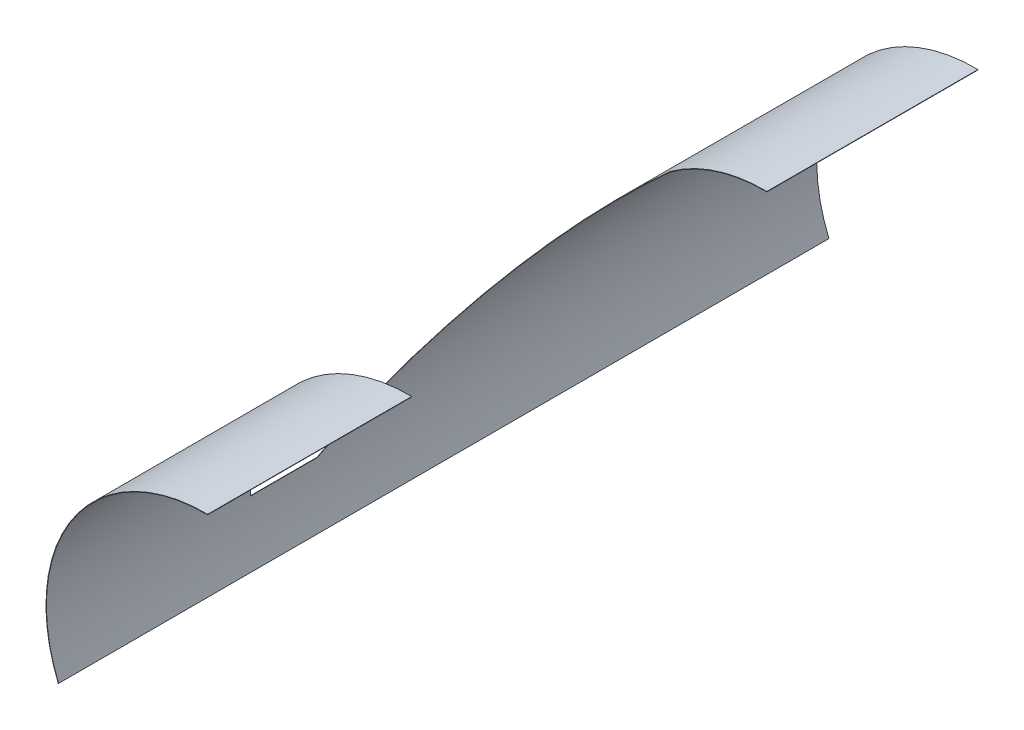
ISO-10303-21;
HEADER;
FILE_DESCRIPTION(('STEP AP214'),'2;1');
FILE_NAME('part.step','',(''),(''),'','','');
FILE_SCHEMA(('AUTOMOTIVE_DESIGN { 1 0 10303 214 1 1 1 1 }'));
ENDSEC;
DATA;
#1=APPLICATION_CONTEXT('core data for automotive mechanical design processes');
#2=APPLICATION_PROTOCOL_DEFINITION('international standard','automotive_design',2000,#1);
#3=PRODUCT_CONTEXT('',#1,'mechanical');
#4=PRODUCT('Part','Part','',(#3));
#5=PRODUCT_RELATED_PRODUCT_CATEGORY('part','',(#4));
#6=PRODUCT_DEFINITION_FORMATION('','',#4);
#7=PRODUCT_DEFINITION_CONTEXT('part definition',#1,'design');
#8=PRODUCT_DEFINITION('design','',#6,#7);
#9=PRODUCT_DEFINITION_SHAPE('','',#8);
#10=(LENGTH_UNIT() NAMED_UNIT(*) SI_UNIT(.MILLI.,.METRE.));
#11=(NAMED_UNIT(*) PLANE_ANGLE_UNIT() SI_UNIT($,.RADIAN.));
#12=(NAMED_UNIT(*) SI_UNIT($,.STERADIAN.) SOLID_ANGLE_UNIT());
#13=UNCERTAINTY_MEASURE_WITH_UNIT(LENGTH_MEASURE(1.E-05),#10,'distance_accuracy_value','');
#14=(GEOMETRIC_REPRESENTATION_CONTEXT(3) GLOBAL_UNCERTAINTY_ASSIGNED_CONTEXT((#13)) GLOBAL_UNIT_ASSIGNED_CONTEXT((#10,
#11,#12)) REPRESENTATION_CONTEXT('',''));
#15=CARTESIAN_POINT('',(0.,0.,0.));
#16=DIRECTION('',(0.,0.,1.));
#17=DIRECTION('',(1.,0.,0.));
#18=AXIS2_PLACEMENT_3D('',#15,#16,#17);
#19=CARTESIAN_POINT('',(0.,1.38777878078145E-13,-2670.88598128334));
#20=DIRECTION('',(0.,0.,1.));
#21=DIRECTION('',(1.,0.,0.));
#22=AXIS2_PLACEMENT_3D('',#19,#20,#21);
#23=CYLINDRICAL_SURFACE('',#22,406.);
#24=CARTESIAN_POINT('',(0.,1.38777878078145E-13,-9.84573388113086));
#25=DIRECTION('',(0.,0.,1.));
#26=DIRECTION('',(1.,0.,0.));
#27=AXIS2_PLACEMENT_3D('',#24,#25,#26);
#28=CIRCLE('',#27,406.);
#29=CARTESIAN_POINT('',(4.99999999999997,405.969210655193,-9.84573388113086));
#30=VERTEX_POINT('',#29);
#31=CARTESIAN_POINT('',(-374.794878018808,-156.092278511356,-9.84573388113086));
#32=VERTEX_POINT('',#31);
#33=EDGE_CURVE('E121',#30,#32,#28,.T.);
#34=ORIENTED_EDGE('',*,*,#33,.T.);
#35=DIRECTION('',(0.,0.,1.));
#36=VECTOR('',#35,1.);
#37=CARTESIAN_POINT('',(-374.794878018808,-156.092278511356,-2670.88598128334));
#38=LINE('',#37,#36);
#39=CARTESIAN_POINT('',(-374.794878018808,-156.092278511356,-1972.84573388114));
#40=VERTEX_POINT('',#39);
#41=EDGE_CURVE('E11',#40,#32,#38,.T.);
#42=ORIENTED_EDGE('',*,*,#41,.F.);
#43=CARTESIAN_POINT('',(0.,1.38777878078145E-13,-1972.84573388114));
#44=DIRECTION('',(0.,0.,-1.));
#45=DIRECTION('',(-1.,0.,0.));
#46=AXIS2_PLACEMENT_3D('',#43,#44,#45);
#47=CIRCLE('',#46,406.);
#48=CARTESIAN_POINT('',(4.99999999999997,405.969210655193,-1972.84573388114));
#49=VERTEX_POINT('',#48);
#50=EDGE_CURVE('E143',#40,#49,#47,.T.);
#51=ORIENTED_EDGE('',*,*,#50,.T.);
#52=DIRECTION('',(0.,0.,1.));
#53=VECTOR('',#52,1.);
#54=CARTESIAN_POINT('',(4.99999999999997,405.969210655193,-2670.88598128334));
#55=LINE('',#54,#53);
#56=CARTESIAN_POINT('',(4.99999999999997,405.969210655193,-1434.84573388116));
#57=VERTEX_POINT('',#56);
#58=EDGE_CURVE('E39',#49,#57,#55,.T.);
#59=ORIENTED_EDGE('',*,*,#58,.T.);
#60=CARTESIAN_POINT('',(0.,1.38777878078145E-13,-1434.84573388116));
#61=DIRECTION('',(0.,0.,1.));
#62=DIRECTION('',(0.,-1.,0.));
#63=AXIS2_PLACEMENT_3D('',#60,#61,#62);
#64=CIRCLE('',#63,406.);
#65=CARTESIAN_POINT('',(-241.768256652279,326.165770851753,-1434.84573388116));
#66=VERTEX_POINT('',#65);
#67=EDGE_CURVE('E157',#57,#66,#64,.T.);
#68=ORIENTED_EDGE('',*,*,#67,.T.);
#69=CARTESIAN_POINT('',(0.,1.38777878078145E-13,-738.259316222479));
#70=DIRECTION('',(0.,0.905638282548148,0.424051059641692));
#71=DIRECTION('',(0.,-0.424051059641692,0.905638282548148));
#72=AXIS2_PLACEMENT_3D('',#69,#70,#71);
#73=ELLIPSE('',#72,957.431872338807,406.);
#74=CARTESIAN_POINT('',(-406.,1.38777878078145E-13,-738.259316222479));
#75=VERTEX_POINT('',#74);
#76=EDGE_CURVE('E179',#66,#75,#73,.T.);
#77=ORIENTED_EDGE('',*,*,#76,.T.);
#78=CARTESIAN_POINT('',(0.,1.38777878078145E-13,-738.259316222479));
#79=DIRECTION('',(0.,0.905236944073035,0.424907137013856));
#80=DIRECTION('',(0.,-0.424907137013856,0.905236944073035));
#81=AXIS2_PLACEMENT_3D('',#78,#79,#80);
#82=ELLIPSE('',#81,955.50289612283,406.);
#83=CARTESIAN_POINT('',(-405.599418023298,-18.0308651806321,-699.845733881131));
#84=VERTEX_POINT('',#83);
#85=EDGE_CURVE('E159',#75,#84,#82,.T.);
#86=ORIENTED_EDGE('',*,*,#85,.T.);
#87=DIRECTION('',(0.,0.,1.));
#88=VECTOR('',#87,1.);
#89=CARTESIAN_POINT('',(-405.599418023298,-18.0308651806318,-2670.88598128334));
#90=LINE('',#89,#88);
#91=CARTESIAN_POINT('',(-405.599418023298,-18.0308651806321,-529.845733881131));
#92=VERTEX_POINT('',#91);
#93=EDGE_CURVE('E162',#84,#92,#90,.T.);
#94=ORIENTED_EDGE('',*,*,#93,.T.);
#95=CARTESIAN_POINT('',(0.,1.38777878078145E-13,-529.845733881131));
#96=DIRECTION('',(0.,0.,-1.));
#97=DIRECTION('',(0.,1.,0.));
#98=AXIS2_PLACEMENT_3D('',#95,#96,#97);
#99=CIRCLE('',#98,406.);
#100=CARTESIAN_POINT('',(4.99999999999997,405.969210655193,-529.845733881131));
#101=VERTEX_POINT('',#100);
#102=EDGE_CURVE('E165',#92,#101,#99,.T.);
#103=ORIENTED_EDGE('',*,*,#102,.T.);
#104=EDGE_CURVE('E135',#101,#30,#55,.T.);
#105=ORIENTED_EDGE('',*,*,#104,.T.);
#106=EDGE_LOOP('',(#34,#42,#51,#59,#68,#77,#86,#94,#103,#105));
#107=FACE_BOUND('',#106,.T.);
#108=ADVANCED_FACE('F35',(#107),#23,.F.);
#109=CARTESIAN_POINT('',(0.,1.38777878078145E-13,-2670.88598128334));
#110=DIRECTION('',(0.,0.,1.));
#111=DIRECTION('',(1.,0.,0.));
#112=AXIS2_PLACEMENT_3D('',#109,#110,#111);
#113=CYLINDRICAL_SURFACE('',#112,407.);
#114=DIRECTION('',(0.,0.,1.));
#115=VECTOR('',#114,1.);
#116=CARTESIAN_POINT('',(-375.71801811245,-156.476742251532,-2670.88598128334));
#117=LINE('',#116,#115);
#118=CARTESIAN_POINT('',(-375.71801811245,-156.476742251532,-1972.84573388114));
#119=VERTEX_POINT('',#118);
#120=CARTESIAN_POINT('',(-375.71801811245,-156.476742251532,-9.84573388113086));
#121=VERTEX_POINT('',#120);
#122=EDGE_CURVE('E44',#119,#121,#117,.T.);
#123=ORIENTED_EDGE('',*,*,#122,.T.);
#124=CARTESIAN_POINT('',(0.,1.38777878078145E-13,-9.84573388113086));
#125=DIRECTION('',(0.,0.,1.));
#126=DIRECTION('',(1.,0.,0.));
#127=AXIS2_PLACEMENT_3D('',#124,#125,#126);
#128=CIRCLE('',#127,407.);
#129=CARTESIAN_POINT('',(5.01231527093589,406.969134819368,-9.84573388113086));
#130=VERTEX_POINT('',#129);
#131=EDGE_CURVE('E52',#130,#121,#128,.T.);
#132=ORIENTED_EDGE('',*,*,#131,.F.);
#133=DIRECTION('',(0.,0.,1.));
#134=VECTOR('',#133,1.);
#135=CARTESIAN_POINT('',(5.01231527093589,406.969134819368,-2670.88598128334));
#136=LINE('',#135,#134);
#137=CARTESIAN_POINT('',(5.01231527093589,406.969134819368,-529.845733881131));
#138=VERTEX_POINT('',#137);
#139=EDGE_CURVE('E118',#138,#130,#136,.T.);
#140=ORIENTED_EDGE('',*,*,#139,.F.);
#141=CARTESIAN_POINT('',(0.,1.38777878078145E-13,-529.845733881131));
#142=DIRECTION('',(0.,0.,1.));
#143=DIRECTION('',(1.,0.,0.));
#144=AXIS2_PLACEMENT_3D('',#141,#142,#143);
#145=CIRCLE('',#144,407.);
#146=CARTESIAN_POINT('',(-406.598431368183,-18.0752761786139,-529.845733881131));
#147=VERTEX_POINT('',#146);
#148=EDGE_CURVE('E60',#147,#138,#145,.F.);
#149=ORIENTED_EDGE('',*,*,#148,.F.);
#150=DIRECTION('',(0.,0.,1.));
#151=VECTOR('',#150,1.);
#152=CARTESIAN_POINT('',(-406.598431368183,-18.0752761786135,-2670.88598128334));
#153=LINE('',#152,#151);
#154=CARTESIAN_POINT('',(-406.598431368183,-18.0752761786137,-699.845733881131));
#155=VERTEX_POINT('',#154);
#156=EDGE_CURVE('E168',#155,#147,#153,.T.);
#157=ORIENTED_EDGE('',*,*,#156,.F.);
#158=CARTESIAN_POINT('',(0.,1.38777878078145E-13,-738.259316222479));
#159=DIRECTION('',(0.,0.904834163168262,0.425764180226086));
#160=DIRECTION('',(0.,-0.425764180226086,0.904834163168262));
#161=AXIS2_PLACEMENT_3D('',#158,#159,#160);
#162=ELLIPSE('',#161,955.928231876806,407.);
#163=CARTESIAN_POINT('',(-407.,-3.23675326903691E-11,-738.25931622241));
#164=VERTEX_POINT('',#163);
#165=EDGE_CURVE('E171',#164,#155,#162,.T.);
#166=ORIENTED_EDGE('',*,*,#165,.F.);
#167=CARTESIAN_POINT('',(0.,1.38777878078145E-13,-738.259316222479));
#168=DIRECTION('',(0.,0.905236944073035,0.424907137013856));
#169=DIRECTION('',(0.,-0.424907137013856,0.905236944073035));
#170=AXIS2_PLACEMENT_3D('',#167,#168,#169);
#171=ELLIPSE('',#170,957.856351532,407.);
#172=CARTESIAN_POINT('',(-242.363744969156,326.969134819368,-1434.84573388116));
#173=VERTEX_POINT('',#172);
#174=EDGE_CURVE('E180',#173,#164,#171,.T.);
#175=ORIENTED_EDGE('',*,*,#174,.F.);
#176=CARTESIAN_POINT('',(0.,1.38777878078145E-13,-1434.84573388116));
#177=DIRECTION('',(0.,0.,1.));
#178=DIRECTION('',(1.,0.,0.));
#179=AXIS2_PLACEMENT_3D('',#176,#177,#178);
#180=CIRCLE('',#179,407.);
#181=CARTESIAN_POINT('',(5.01231527093589,406.969134819368,-1434.84573388116));
#182=VERTEX_POINT('',#181);
#183=EDGE_CURVE('E151',#182,#173,#180,.T.);
#184=ORIENTED_EDGE('',*,*,#183,.F.);
#185=CARTESIAN_POINT('',(5.01231527093589,406.969134819368,-1972.84573388114));
#186=VERTEX_POINT('',#185);
#187=EDGE_CURVE('E132',#186,#182,#136,.T.);
#188=ORIENTED_EDGE('',*,*,#187,.F.);
#189=CARTESIAN_POINT('',(0.,1.38777878078145E-13,-1972.84573388114));
#190=DIRECTION('',(0.,0.,1.));
#191=DIRECTION('',(1.,0.,0.));
#192=AXIS2_PLACEMENT_3D('',#189,#190,#191);
#193=CIRCLE('',#192,407.);
#194=EDGE_CURVE('E138',#186,#119,#193,.T.);
#195=ORIENTED_EDGE('',*,*,#194,.T.);
#196=EDGE_LOOP('',(#123,#132,#140,#149,#157,#166,#175,#184,#188,#195));
#197=FACE_BOUND('',#196,.T.);
#198=ADVANCED_FACE('F116',(#197),#113,.T.);
#199=CARTESIAN_POINT('',(5.01231527093589,406.969134819368,-2670.88598128334));
#200=DIRECTION('',(-0.999924164175351,0.0123152709359198,0.));
#201=DIRECTION('',(-0.0123152709359198,-0.999924164175351,0.));
#202=AXIS2_PLACEMENT_3D('',#199,#200,#201);
#203=PLANE('',#202);
#204=DIRECTION('',(-0.0123152709359605,-0.999924164175351,0.));
#205=VECTOR('',#204,1.);
#206=CARTESIAN_POINT('',(4.99999999999997,405.969210655193,-9.84573388113086));
#207=LINE('',#206,#205);
#208=EDGE_CURVE('E122',#30,#130,#207,.F.);
#209=ORIENTED_EDGE('',*,*,#208,.F.);
#210=ORIENTED_EDGE('',*,*,#104,.F.);
#211=DIRECTION('',(-0.0123152709359605,-0.999924164175351,0.));
#212=VECTOR('',#211,1.);
#213=CARTESIAN_POINT('',(4.99999999999997,405.969210655193,-529.845733881131));
#214=LINE('',#213,#212);
#215=EDGE_CURVE('E131',#101,#138,#214,.F.);
#216=ORIENTED_EDGE('',*,*,#215,.T.);
#217=ORIENTED_EDGE('',*,*,#139,.T.);
#218=EDGE_LOOP('',(#209,#210,#216,#217));
#219=FACE_BOUND('',#218,.T.);
#220=ADVANCED_FACE('F130',(#219),#203,.F.);
#221=CARTESIAN_POINT('',(-374.794878018808,-156.092278511356,-2670.88598128334));
#222=DIRECTION('',(-0.384463740175602,0.923140093642448,0.));
#223=DIRECTION('',(-0.923140093642448,-0.384463740175602,0.));
#224=AXIS2_PLACEMENT_3D('',#221,#222,#223);
#225=PLANE('',#224);
#226=DIRECTION('',(-0.923140093642385,-0.384463740175754,0.));
#227=VECTOR('',#226,1.);
#228=CARTESIAN_POINT('',(-375.718018112451,-156.476742251532,-9.84573388113086));
#229=LINE('',#228,#227);
#230=EDGE_CURVE('E183',#121,#32,#229,.F.);
#231=ORIENTED_EDGE('',*,*,#230,.F.);
#232=ORIENTED_EDGE('',*,*,#122,.F.);
#233=DIRECTION('',(0.923140093642384,0.384463740175754,0.));
#234=VECTOR('',#233,1.);
#235=CARTESIAN_POINT('',(-374.794878018808,-156.092278511356,-1972.84573388114));
#236=LINE('',#235,#234);
#237=EDGE_CURVE('E141',#40,#119,#236,.F.);
#238=ORIENTED_EDGE('',*,*,#237,.F.);
#239=ORIENTED_EDGE('',*,*,#41,.T.);
#240=EDGE_LOOP('',(#231,#232,#238,#239));
#241=FACE_BOUND('',#240,.T.);
#242=ADVANCED_FACE('F191',(#241),#225,.F.);
#243=DIRECTION('',(-0.0123152709359605,-0.999924164175351,0.));
#244=VECTOR('',#243,1.);
#245=CARTESIAN_POINT('',(4.99999999999997,405.969210655193,-1434.84573388116));
#246=LINE('',#245,#244);
#247=EDGE_CURVE('E154',#57,#182,#246,.F.);
#248=ORIENTED_EDGE('',*,*,#247,.F.);
#249=ORIENTED_EDGE('',*,*,#58,.F.);
#250=DIRECTION('',(-0.0123152709359605,-0.999924164175351,0.));
#251=VECTOR('',#250,1.);
#252=CARTESIAN_POINT('',(4.99999999999997,405.969210655193,-1972.84573388114));
#253=LINE('',#252,#251);
#254=EDGE_CURVE('E140',#49,#186,#253,.F.);
#255=ORIENTED_EDGE('',*,*,#254,.T.);
#256=ORIENTED_EDGE('',*,*,#187,.T.);
#257=EDGE_LOOP('',(#248,#249,#255,#256));
#258=FACE_BOUND('',#257,.T.);
#259=ADVANCED_FACE('F37',(#258),#203,.F.);
#260=CARTESIAN_POINT('',(0.,1.38777878078145E-13,-1972.84573388114));
#261=DIRECTION('',(0.,0.,1.));
#262=DIRECTION('',(1.,0.,0.));
#263=AXIS2_PLACEMENT_3D('',#260,#261,#262);
#264=PLANE('',#263);
#265=ORIENTED_EDGE('',*,*,#254,.F.);
#266=ORIENTED_EDGE('',*,*,#50,.F.);
#267=ORIENTED_EDGE('',*,*,#237,.T.);
#268=ORIENTED_EDGE('',*,*,#194,.F.);
#269=EDGE_LOOP('',(#265,#266,#267,#268));
#270=FACE_BOUND('',#269,.T.);
#271=ADVANCED_FACE('F193',(#270),#264,.F.);
#272=CARTESIAN_POINT('',(0.,1.38777878078145E-13,-529.845733881131));
#273=DIRECTION('',(0.,0.,1.));
#274=DIRECTION('',(0.,-1.,0.));
#275=AXIS2_PLACEMENT_3D('',#272,#273,#274);
#276=PLANE('',#275);
#277=ORIENTED_EDGE('',*,*,#102,.F.);
#278=DIRECTION('',(0.99901334488497,0.0444109979818527,0.));
#279=VECTOR('',#278,1.);
#280=CARTESIAN_POINT('',(-405.599418023298,-18.0308651806321,-529.845733881131));
#281=LINE('',#280,#279);
#282=EDGE_CURVE('E149',#92,#147,#281,.F.);
#283=ORIENTED_EDGE('',*,*,#282,.T.);
#284=ORIENTED_EDGE('',*,*,#148,.T.);
#285=ORIENTED_EDGE('',*,*,#215,.F.);
#286=EDGE_LOOP('',(#277,#283,#284,#285));
#287=FACE_BOUND('',#286,.T.);
#288=ADVANCED_FACE('F209',(#287),#276,.F.);
#289=CARTESIAN_POINT('',(0.,1.38777878078145E-13,-1434.84573388116));
#290=DIRECTION('',(0.,0.,-1.));
#291=DIRECTION('',(0.,1.,0.));
#292=AXIS2_PLACEMENT_3D('',#289,#290,#291);
#293=PLANE('',#292);
#294=ORIENTED_EDGE('',*,*,#183,.T.);
#295=DIRECTION('',(-0.595488316877533,0.803363967615154,0.));
#296=VECTOR('',#295,1.);
#297=CARTESIAN_POINT('',(-242.363744969156,326.969134819368,-1434.84573388116));
#298=LINE('',#297,#296);
#299=EDGE_CURVE('E167',#173,#66,#298,.F.);
#300=ORIENTED_EDGE('',*,*,#299,.T.);
#301=ORIENTED_EDGE('',*,*,#67,.F.);
#302=ORIENTED_EDGE('',*,*,#247,.T.);
#303=EDGE_LOOP('',(#294,#300,#301,#302));
#304=FACE_BOUND('',#303,.T.);
#305=ADVANCED_FACE('F206',(#304),#293,.F.);
#306=CARTESIAN_POINT('',(0.,-406.,126.697205516687));
#307=CARTESIAN_POINT('',(0.,-406.333333333333,126.697205516687));
#308=CARTESIAN_POINT('',(0.,-406.666666666667,126.697205516687));
#309=CARTESIAN_POINT('',(0.,-407.,126.697205516687));
#310=CARTESIAN_POINT('',(812.,-406.,126.697205516687));
#311=CARTESIAN_POINT('',(812.666666666667,-406.333333333333,126.697205516687));
#312=CARTESIAN_POINT('',(813.333333333333,-406.666666666667,126.697205516687));
#313=CARTESIAN_POINT('',(814.,-407.,126.697205516687));
#314=CARTESIAN_POINT('',(812.,406.,-1603.21583796165));
#315=CARTESIAN_POINT('',(812.666666666667,406.333333333333,-1603.21583796165));
#316=CARTESIAN_POINT('',(813.333333333333,406.666666666667,-1603.21583796165));
#317=CARTESIAN_POINT('',(814.,407.,-1603.21583796165));
#318=CARTESIAN_POINT('',(0.,406.,-1603.21583796165));
#319=CARTESIAN_POINT('',(0.,406.333333333333,-1603.21583796164));
#320=CARTESIAN_POINT('',(0.,406.666666666667,-1603.21583796165));
#321=CARTESIAN_POINT('',(0.,407.,-1603.21583796165));
#322=CARTESIAN_POINT('',(-812.,406.,-1603.21583796165));
#323=CARTESIAN_POINT('',(-812.666666666667,406.333333333334,-1603.21583796165));
#324=CARTESIAN_POINT('',(-813.333333333333,406.666666666667,-1603.21583796165));
#325=CARTESIAN_POINT('',(-814.,407.,-1603.21583796165));
#326=CARTESIAN_POINT('',(-812.,-406.,126.697205516687));
#327=CARTESIAN_POINT('',(-812.666666666667,-406.333333333333,126.697205516687));
#328=CARTESIAN_POINT('',(-813.333333333333,-406.666666666667,126.697205516687));
#329=CARTESIAN_POINT('',(-814.,-407.,126.697205516687));
#330=CARTESIAN_POINT('',(0.,-406.,126.697205516687));
#331=CARTESIAN_POINT('',(0.,-406.333333333333,126.697205516687));
#332=CARTESIAN_POINT('',(0.,-406.666666666667,126.697205516687));
#333=CARTESIAN_POINT('',(0.,-407.,126.697205516687));
#334=(BOUNDED_SURFACE() B_SPLINE_SURFACE(3,3,((#306,#307,#308,#309),(#310,#311,#312,#313),(#314,
#315,#316,#317),(#318,#319,#320,#321),(#322,#323,#324,#325),(#326,#327,#328,#329),(#330,#331,
#332,#333)),.UNSPECIFIED.,.T.,.F.,.F.) B_SPLINE_SURFACE_WITH_KNOTS((4,3,4),(4,4),(0.,0.5,1.),
(0.,1.),.UNSPECIFIED.) GEOMETRIC_REPRESENTATION_ITEM() RATIONAL_B_SPLINE_SURFACE(((1.,1.,1.,1.),
(0.333333333333333,0.333333333333333,0.333333333333333,0.333333333333333),(0.333333333333333,
0.333333333333333,0.333333333333333,0.333333333333333),(1.,1.,1.,1.),(0.333333333333333,
0.333333333333333,0.333333333333333,0.333333333333333),(0.333333333333333,0.333333333333333,
0.333333333333333,0.333333333333333),(1.,1.,1.,1.))) REPRESENTATION_ITEM('') SURFACE());
#335=DIRECTION('',(-1.,0.,0.));
#336=VECTOR('',#335,1.);
#337=CARTESIAN_POINT('',(-407.,1.52655665885959E-13,-738.259316222479));
#338=LINE('',#337,#336);
#339=EDGE_CURVE('E177',#164,#75,#338,.F.);
#340=DIRECTION('',(0.99901334488497,0.0444109979818527,0.));
#341=VECTOR('',#340,1.);
#342=CARTESIAN_POINT('',(-405.599418023298,-18.0308651806321,-699.845733881131));
#343=LINE('',#342,#341);
#344=EDGE_CURVE('E148',#84,#155,#343,.F.);
#345=ORIENTED_EDGE('',*,*,#339,.F.);
#346=ORIENTED_EDGE('',*,*,#165,.T.);
#347=ORIENTED_EDGE('',*,*,#344,.F.);
#348=ORIENTED_EDGE('',*,*,#85,.F.);
#349=EDGE_LOOP('',(#345,#346,#347,#348));
#350=FACE_BOUND('',#349,.T.);
#351=ADVANCED_FACE('F208',(#350),#334,.F.);
#352=CARTESIAN_POINT('',(-405.599418023298,-18.0308651806318,-614.845733881131));
#353=DIRECTION('',(0.0444109979818521,-0.99901334488497,0.));
#354=DIRECTION('',(0.,0.,1.));
#355=AXIS2_PLACEMENT_3D('',#352,#353,#354);
#356=PLANE('',#355);
#357=ORIENTED_EDGE('',*,*,#93,.F.);
#358=ORIENTED_EDGE('',*,*,#344,.T.);
#359=ORIENTED_EDGE('',*,*,#156,.T.);
#360=ORIENTED_EDGE('',*,*,#282,.F.);
#361=EDGE_LOOP('',(#357,#358,#359,#360));
#362=FACE_BOUND('',#361,.T.);
#363=ADVANCED_FACE('F215',(#362),#356,.F.);
#364=CARTESIAN_POINT('',(0.,-406.,128.827640299295));
#365=CARTESIAN_POINT('',(0.,-406.333333333333,128.827640299295));
#366=CARTESIAN_POINT('',(0.,-406.666666666667,128.827640299295));
#367=CARTESIAN_POINT('',(0.,-407.,128.827640299295));
#368=CARTESIAN_POINT('',(812.,-406.,128.827640299295));
#369=CARTESIAN_POINT('',(812.666666666667,-406.333333333333,128.827640299295));
#370=CARTESIAN_POINT('',(813.333333333333,-406.666666666667,128.827640299295));
#371=CARTESIAN_POINT('',(814.,-407.,128.827640299295));
#372=CARTESIAN_POINT('',(812.,406.,-1605.34627274425));
#373=CARTESIAN_POINT('',(812.666666666667,406.333333333333,-1605.34627274425));
#374=CARTESIAN_POINT('',(813.333333333333,406.666666666667,-1605.34627274425));
#375=CARTESIAN_POINT('',(814.,407.,-1605.34627274425));
#376=CARTESIAN_POINT('',(0.,406.,-1605.34627274425));
#377=CARTESIAN_POINT('',(0.,406.333333333333,-1605.34627274425));
#378=CARTESIAN_POINT('',(0.,406.666666666667,-1605.34627274425));
#379=CARTESIAN_POINT('',(0.,407.,-1605.34627274425));
#380=CARTESIAN_POINT('',(-812.,406.,-1605.34627274425));
#381=CARTESIAN_POINT('',(-812.666666666667,406.333333333334,-1605.34627274425));
#382=CARTESIAN_POINT('',(-813.333333333333,406.666666666667,-1605.34627274425));
#383=CARTESIAN_POINT('',(-814.,407.,-1605.34627274425));
#384=CARTESIAN_POINT('',(-812.,-406.,128.827640299295));
#385=CARTESIAN_POINT('',(-812.666666666667,-406.333333333333,128.827640299295));
#386=CARTESIAN_POINT('',(-813.333333333333,-406.666666666667,128.827640299295));
#387=CARTESIAN_POINT('',(-814.,-407.,128.827640299295));
#388=CARTESIAN_POINT('',(0.,-406.,128.827640299295));
#389=CARTESIAN_POINT('',(0.,-406.333333333333,128.827640299295));
#390=CARTESIAN_POINT('',(0.,-406.666666666667,128.827640299295));
#391=CARTESIAN_POINT('',(0.,-407.,128.827640299295));
#392=(BOUNDED_SURFACE() B_SPLINE_SURFACE(3,3,((#364,#365,#366,#367),(#368,#369,#370,#371),(#372,
#373,#374,#375),(#376,#377,#378,#379),(#380,#381,#382,#383),(#384,#385,#386,#387),(#388,#389,
#390,#391)),.UNSPECIFIED.,.T.,.F.,.F.) B_SPLINE_SURFACE_WITH_KNOTS((4,3,4),(4,4),(0.,0.5,1.),
(0.,1.),.UNSPECIFIED.) GEOMETRIC_REPRESENTATION_ITEM() RATIONAL_B_SPLINE_SURFACE(((1.,1.,1.,1.),
(0.333333333333333,0.333333333333333,0.333333333333333,0.333333333333333),(0.333333333333333,
0.333333333333333,0.333333333333333,0.333333333333333),(1.,1.,1.,1.),(0.333333333333333,
0.333333333333333,0.333333333333333,0.333333333333333),(0.333333333333333,0.333333333333333,
0.333333333333333,0.333333333333333),(1.,1.,1.,1.))) REPRESENTATION_ITEM('') SURFACE());
#393=ORIENTED_EDGE('',*,*,#299,.F.);
#394=ORIENTED_EDGE('',*,*,#174,.T.);
#395=ORIENTED_EDGE('',*,*,#339,.T.);
#396=ORIENTED_EDGE('',*,*,#76,.F.);
#397=EDGE_LOOP('',(#393,#394,#395,#396));
#398=FACE_BOUND('',#397,.T.);
#399=ADVANCED_FACE('F204',(#398),#392,.F.);
#400=CARTESIAN_POINT('',(0.,1.38777878078145E-13,-9.84573388113086));
#401=DIRECTION('',(0.,0.,-1.));
#402=DIRECTION('',(-1.,0.,0.));
#403=AXIS2_PLACEMENT_3D('',#400,#401,#402);
#404=PLANE('',#403);
#405=ORIENTED_EDGE('',*,*,#33,.F.);
#406=ORIENTED_EDGE('',*,*,#208,.T.);
#407=ORIENTED_EDGE('',*,*,#131,.T.);
#408=ORIENTED_EDGE('',*,*,#230,.T.);
#409=EDGE_LOOP('',(#405,#406,#407,#408));
#410=FACE_BOUND('',#409,.T.);
#411=ADVANCED_FACE('F125',(#410),#404,.F.);
#412=CLOSED_SHELL('',(#108,#198,#220,#242,#259,#271,#288,#305,#351,#363,#399,#411));
#413=MANIFOLD_SOLID_BREP('B2',#412);
#414=ADVANCED_BREP_SHAPE_REPRESENTATION('',(#18,#413),#14);
#415=SHAPE_DEFINITION_REPRESENTATION(#9,#414);
ENDSEC;
END-ISO-10303-21;
